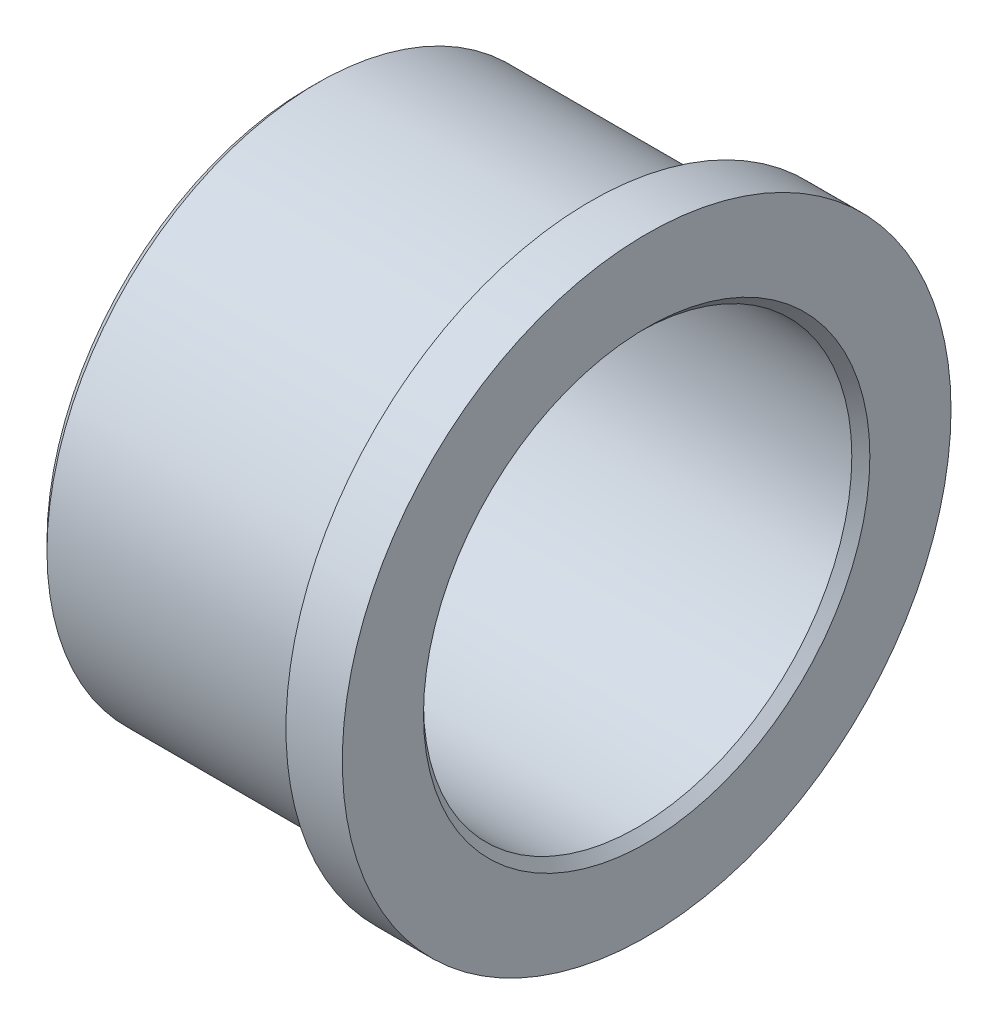
ISO-10303-21;
HEADER;
FILE_DESCRIPTION(('STEP AP214'),'2;1');
FILE_NAME('part.step','',(''),(''),'','','');
FILE_SCHEMA(('AUTOMOTIVE_DESIGN { 1 0 10303 214 1 1 1 1 }'));
ENDSEC;
DATA;
#1=APPLICATION_CONTEXT('core data for automotive mechanical design processes');
#2=APPLICATION_PROTOCOL_DEFINITION('international standard','automotive_design',2000,#1);
#3=PRODUCT_CONTEXT('',#1,'mechanical');
#4=PRODUCT('Part','Part','',(#3));
#5=PRODUCT_RELATED_PRODUCT_CATEGORY('part','',(#4));
#6=PRODUCT_DEFINITION_FORMATION('','',#4);
#7=PRODUCT_DEFINITION_CONTEXT('part definition',#1,'design');
#8=PRODUCT_DEFINITION('design','',#6,#7);
#9=PRODUCT_DEFINITION_SHAPE('','',#8);
#10=(LENGTH_UNIT() NAMED_UNIT(*) SI_UNIT(.MILLI.,.METRE.));
#11=(NAMED_UNIT(*) PLANE_ANGLE_UNIT() SI_UNIT($,.RADIAN.));
#12=(NAMED_UNIT(*) SI_UNIT($,.STERADIAN.) SOLID_ANGLE_UNIT());
#13=UNCERTAINTY_MEASURE_WITH_UNIT(LENGTH_MEASURE(1.E-05),#10,'distance_accuracy_value','');
#14=(GEOMETRIC_REPRESENTATION_CONTEXT(3) GLOBAL_UNCERTAINTY_ASSIGNED_CONTEXT((#13)) GLOBAL_UNIT_ASSIGNED_CONTEXT((#10,
#11,#12)) REPRESENTATION_CONTEXT('',''));
#15=CARTESIAN_POINT('',(0.,0.,0.));
#16=DIRECTION('',(0.,0.,1.));
#17=DIRECTION('',(1.,0.,0.));
#18=AXIS2_PLACEMENT_3D('',#15,#16,#17);
#19=CARTESIAN_POINT('',(0.,25.3690789507421,0.));
#20=DIRECTION('',(-1.,0.,0.));
#21=DIRECTION('',(0.,0.,1.));
#22=AXIS2_PLACEMENT_3D('',#19,#20,#21);
#23=PLANE('',#22);
#24=CARTESIAN_POINT('',(0.,0.,0.));
#25=DIRECTION('',(1.,0.,0.));
#26=DIRECTION('',(0.,0.,-1.));
#27=AXIS2_PLACEMENT_3D('',#24,#25,#26);
#28=CIRCLE('',#27,23.8);
#29=CARTESIAN_POINT('',(0.,0.,-23.8));
#30=VERTEX_POINT('',#29);
#31=EDGE_CURVE('E80',#30,#30,#28,.T.);
#32=ORIENTED_EDGE('',*,*,#31,.T.);
#33=EDGE_LOOP('',(#32));
#34=FACE_BOUND('',#33,.T.);
#35=CARTESIAN_POINT('',(0.,0.,0.));
#36=DIRECTION('',(1.,0.,0.));
#37=DIRECTION('',(0.,0.,-1.));
#38=AXIS2_PLACEMENT_3D('',#35,#36,#37);
#39=CIRCLE('',#38,27.);
#40=CARTESIAN_POINT('',(0.,0.,-27.));
#41=VERTEX_POINT('',#40);
#42=EDGE_CURVE('E68',#41,#41,#39,.T.);
#43=ORIENTED_EDGE('',*,*,#42,.F.);
#44=EDGE_LOOP('',(#43));
#45=FACE_BOUND('',#44,.T.);
#46=ADVANCED_FACE('F41',(#34,#45),#23,.T.);
#47=CARTESIAN_POINT('',(6.5,0.,0.));
#48=DIRECTION('',(1.,0.,0.));
#49=DIRECTION('',(0.,0.,-1.));
#50=AXIS2_PLACEMENT_3D('',#47,#48,#49);
#51=CYLINDRICAL_SURFACE('',#50,27.);
#52=ORIENTED_EDGE('',*,*,#42,.T.);
#53=EDGE_LOOP('',(#52));
#54=FACE_BOUND('',#53,.T.);
#55=CARTESIAN_POINT('',(5.,0.,0.));
#56=DIRECTION('',(1.,0.,0.));
#57=DIRECTION('',(0.,0.,-1.));
#58=AXIS2_PLACEMENT_3D('',#55,#56,#57);
#59=CIRCLE('',#58,27.);
#60=CARTESIAN_POINT('',(5.,0.,-27.));
#61=VERTEX_POINT('',#60);
#62=EDGE_CURVE('E71',#61,#61,#59,.T.);
#63=ORIENTED_EDGE('',*,*,#62,.F.);
#64=EDGE_LOOP('',(#63));
#65=FACE_BOUND('',#64,.T.);
#66=ADVANCED_FACE('F104',(#54,#65),#51,.T.);
#67=CARTESIAN_POINT('',(5.,27.,0.));
#68=DIRECTION('',(1.,0.,0.));
#69=DIRECTION('',(0.,0.,-1.));
#70=AXIS2_PLACEMENT_3D('',#67,#68,#69);
#71=PLANE('',#70);
#72=CARTESIAN_POINT('',(5.,0.,0.));
#73=DIRECTION('',(1.,0.,0.));
#74=DIRECTION('',(0.,0.,-1.));
#75=AXIS2_PLACEMENT_3D('',#72,#73,#74);
#76=CIRCLE('',#75,19.8);
#77=CARTESIAN_POINT('',(5.,0.,-19.8));
#78=VERTEX_POINT('',#77);
#79=EDGE_CURVE('E57',#78,#78,#76,.F.);
#80=ORIENTED_EDGE('',*,*,#79,.T.);
#81=EDGE_LOOP('',(#80));
#82=FACE_BOUND('',#81,.T.);
#83=ORIENTED_EDGE('',*,*,#62,.T.);
#84=EDGE_LOOP('',(#83));
#85=FACE_BOUND('',#84,.T.);
#86=ADVANCED_FACE('F109',(#82,#85),#71,.T.);
#87=CARTESIAN_POINT('',(6.5,0.,0.));
#88=DIRECTION('',(1.,0.,0.));
#89=DIRECTION('',(0.,0.,-1.));
#90=AXIS2_PLACEMENT_3D('',#87,#88,#89);
#91=CYLINDRICAL_SURFACE('',#90,19.);
#92=CARTESIAN_POINT('',(4.20000000000002,0.,0.));
#93=DIRECTION('',(1.,0.,0.));
#94=DIRECTION('',(0.,0.,-1.));
#95=AXIS2_PLACEMENT_3D('',#92,#93,#94);
#96=CIRCLE('',#95,19.);
#97=CARTESIAN_POINT('',(4.20000000000002,0.,-19.));
#98=VERTEX_POINT('',#97);
#99=EDGE_CURVE('E62',#98,#98,#96,.T.);
#100=ORIENTED_EDGE('',*,*,#99,.T.);
#101=EDGE_LOOP('',(#100));
#102=FACE_BOUND('',#101,.T.);
#103=CARTESIAN_POINT('',(-24.2,0.,0.));
#104=DIRECTION('',(-1.,0.,0.));
#105=DIRECTION('',(0.,0.,1.));
#106=AXIS2_PLACEMENT_3D('',#103,#104,#105);
#107=CIRCLE('',#106,19.);
#108=CARTESIAN_POINT('',(-24.2,0.,19.));
#109=VERTEX_POINT('',#108);
#110=EDGE_CURVE('E65',#109,#109,#107,.T.);
#111=ORIENTED_EDGE('',*,*,#110,.T.);
#112=EDGE_LOOP('',(#111));
#113=FACE_BOUND('',#112,.T.);
#114=ADVANCED_FACE('F138',(#102,#113),#91,.F.);
#115=CARTESIAN_POINT('',(-25.,19.,0.));
#116=DIRECTION('',(-1.,0.,0.));
#117=DIRECTION('',(0.,0.,1.));
#118=AXIS2_PLACEMENT_3D('',#115,#116,#117);
#119=PLANE('',#118);
#120=CARTESIAN_POINT('',(-25.,0.,0.));
#121=DIRECTION('',(-1.,0.,0.));
#122=DIRECTION('',(0.,0.,1.));
#123=AXIS2_PLACEMENT_3D('',#120,#121,#122);
#124=CIRCLE('',#123,23.2);
#125=CARTESIAN_POINT('',(-25.,0.,23.2));
#126=VERTEX_POINT('',#125);
#127=EDGE_CURVE('E10',#126,#126,#124,.T.);
#128=ORIENTED_EDGE('',*,*,#127,.T.);
#129=EDGE_LOOP('',(#128));
#130=FACE_BOUND('',#129,.T.);
#131=CARTESIAN_POINT('',(-25.,0.,0.));
#132=DIRECTION('',(-1.,0.,0.));
#133=DIRECTION('',(0.,0.,1.));
#134=AXIS2_PLACEMENT_3D('',#131,#132,#133);
#135=CIRCLE('',#134,19.8);
#136=CARTESIAN_POINT('',(-25.,0.,19.8));
#137=VERTEX_POINT('',#136);
#138=EDGE_CURVE('E49',#137,#137,#135,.F.);
#139=ORIENTED_EDGE('',*,*,#138,.T.);
#140=EDGE_LOOP('',(#139));
#141=FACE_BOUND('',#140,.T.);
#142=ADVANCED_FACE('F130',(#130,#141),#119,.T.);
#143=CARTESIAN_POINT('',(6.5,0.,0.));
#144=DIRECTION('',(1.,0.,0.));
#145=DIRECTION('',(0.,0.,-1.));
#146=AXIS2_PLACEMENT_3D('',#143,#144,#145);
#147=CYLINDRICAL_SURFACE('',#146,24.);
#148=CARTESIAN_POINT('',(-24.2,0.,0.));
#149=DIRECTION('',(-1.,0.,0.));
#150=DIRECTION('',(0.,0.,1.));
#151=AXIS2_PLACEMENT_3D('',#148,#149,#150);
#152=CIRCLE('',#151,24.);
#153=CARTESIAN_POINT('',(-24.2,0.,24.));
#154=VERTEX_POINT('',#153);
#155=EDGE_CURVE('E53',#154,#154,#152,.F.);
#156=ORIENTED_EDGE('',*,*,#155,.T.);
#157=EDGE_LOOP('',(#156));
#158=FACE_BOUND('',#157,.T.);
#159=CARTESIAN_POINT('',(-2.,0.,0.));
#160=DIRECTION('',(1.,0.,0.));
#161=DIRECTION('',(0.,0.,-1.));
#162=AXIS2_PLACEMENT_3D('',#159,#160,#161);
#163=CIRCLE('',#162,24.);
#164=CARTESIAN_POINT('',(-2.,0.,-24.));
#165=VERTEX_POINT('',#164);
#166=EDGE_CURVE('E74',#165,#165,#163,.T.);
#167=ORIENTED_EDGE('',*,*,#166,.F.);
#168=EDGE_LOOP('',(#167));
#169=FACE_BOUND('',#168,.T.);
#170=ADVANCED_FACE('F100',(#158,#169),#147,.T.);
#171=CARTESIAN_POINT('',(-2.,23.8,0.));
#172=DIRECTION('',(1.,0.,0.));
#173=DIRECTION('',(0.,0.,-1.));
#174=AXIS2_PLACEMENT_3D('',#171,#172,#173);
#175=PLANE('',#174);
#176=ORIENTED_EDGE('',*,*,#166,.T.);
#177=EDGE_LOOP('',(#176));
#178=FACE_BOUND('',#177,.T.);
#179=CARTESIAN_POINT('',(-2.,0.,0.));
#180=DIRECTION('',(1.,0.,0.));
#181=DIRECTION('',(0.,0.,-1.));
#182=AXIS2_PLACEMENT_3D('',#179,#180,#181);
#183=CIRCLE('',#182,23.8);
#184=CARTESIAN_POINT('',(-2.,0.,-23.8));
#185=VERTEX_POINT('',#184);
#186=EDGE_CURVE('E77',#185,#185,#183,.T.);
#187=ORIENTED_EDGE('',*,*,#186,.F.);
#188=EDGE_LOOP('',(#187));
#189=FACE_BOUND('',#188,.T.);
#190=ADVANCED_FACE('F89',(#178,#189),#175,.T.);
#191=CARTESIAN_POINT('',(6.5,0.,0.));
#192=DIRECTION('',(1.,0.,0.));
#193=DIRECTION('',(0.,0.,-1.));
#194=AXIS2_PLACEMENT_3D('',#191,#192,#193);
#195=CYLINDRICAL_SURFACE('',#194,23.8);
#196=ORIENTED_EDGE('',*,*,#186,.T.);
#197=EDGE_LOOP('',(#196));
#198=FACE_BOUND('',#197,.T.);
#199=ORIENTED_EDGE('',*,*,#31,.F.);
#200=EDGE_LOOP('',(#199));
#201=FACE_BOUND('',#200,.T.);
#202=ADVANCED_FACE('F86',(#198,#201),#195,.T.);
#203=CARTESIAN_POINT('',(4.20000000000002,0.,0.));
#204=DIRECTION('',(1.,0.,0.));
#205=DIRECTION('',(0.,0.,-1.));
#206=AXIS2_PLACEMENT_3D('',#203,#204,#205);
#207=CONICAL_SURFACE('',#206,19.,0.785398163397455);
#208=CARTESIAN_POINT('',(5.,0.,-19.8));
#209=CARTESIAN_POINT('',(4.99166666666667,0.,-19.7916666666667));
#210=CARTESIAN_POINT('',(4.98333333333333,0.,-19.7833333333333));
#211=CARTESIAN_POINT('',(4.96666666666667,0.,-19.7666666666667));
#212=CARTESIAN_POINT('',(4.95833333333333,0.,-19.7583333333333));
#213=CARTESIAN_POINT('',(4.94166666666667,0.,-19.7416666666667));
#214=CARTESIAN_POINT('',(4.93333333333334,0.,-19.7333333333333));
#215=CARTESIAN_POINT('',(4.91666666666667,0.,-19.7166666666667));
#216=CARTESIAN_POINT('',(4.90833333333334,0.,-19.7083333333333));
#217=CARTESIAN_POINT('',(4.89166666666667,0.,-19.6916666666667));
#218=CARTESIAN_POINT('',(4.88333333333334,0.,-19.6833333333333));
#219=CARTESIAN_POINT('',(4.86666666666667,0.,-19.6666666666667));
#220=CARTESIAN_POINT('',(4.85833333333334,0.,-19.6583333333333));
#221=CARTESIAN_POINT('',(4.84166666666667,0.,-19.6416666666667));
#222=CARTESIAN_POINT('',(4.83333333333334,0.,-19.6333333333333));
#223=CARTESIAN_POINT('',(4.81666666666667,0.,-19.6166666666667));
#224=CARTESIAN_POINT('',(4.80833333333334,0.,-19.6083333333333));
#225=CARTESIAN_POINT('',(4.79166666666667,0.,-19.5916666666667));
#226=CARTESIAN_POINT('',(4.78333333333334,0.,-19.5833333333333));
#227=CARTESIAN_POINT('',(4.76666666666667,0.,-19.5666666666667));
#228=CARTESIAN_POINT('',(4.75833333333334,0.,-19.5583333333333));
#229=CARTESIAN_POINT('',(4.74166666666667,0.,-19.5416666666667));
#230=CARTESIAN_POINT('',(4.73333333333334,0.,-19.5333333333333));
#231=CARTESIAN_POINT('',(4.71666666666667,0.,-19.5166666666667));
#232=CARTESIAN_POINT('',(4.70833333333334,0.,-19.5083333333333));
#233=CARTESIAN_POINT('',(4.69166666666668,0.,-19.4916666666667));
#234=CARTESIAN_POINT('',(4.68333333333334,0.,-19.4833333333333));
#235=CARTESIAN_POINT('',(4.66666666666668,0.,-19.4666666666667));
#236=CARTESIAN_POINT('',(4.65833333333334,0.,-19.4583333333333));
#237=CARTESIAN_POINT('',(4.64166666666668,0.,-19.4416666666667));
#238=CARTESIAN_POINT('',(4.63333333333334,0.,-19.4333333333333));
#239=CARTESIAN_POINT('',(4.61666666666668,0.,-19.4166666666667));
#240=CARTESIAN_POINT('',(4.60833333333334,0.,-19.4083333333333));
#241=CARTESIAN_POINT('',(4.59166666666668,0.,-19.3916666666667));
#242=CARTESIAN_POINT('',(4.58333333333335,0.,-19.3833333333333));
#243=CARTESIAN_POINT('',(4.56666666666668,0.,-19.3666666666667));
#244=CARTESIAN_POINT('',(4.55833333333335,0.,-19.3583333333333));
#245=CARTESIAN_POINT('',(4.54166666666668,0.,-19.3416666666667));
#246=CARTESIAN_POINT('',(4.53333333333335,0.,-19.3333333333333));
#247=CARTESIAN_POINT('',(4.51666666666668,0.,-19.3166666666667));
#248=CARTESIAN_POINT('',(4.50833333333335,0.,-19.3083333333333));
#249=CARTESIAN_POINT('',(4.49166666666668,0.,-19.2916666666667));
#250=CARTESIAN_POINT('',(4.48333333333335,0.,-19.2833333333333));
#251=CARTESIAN_POINT('',(4.46666666666668,0.,-19.2666666666667));
#252=CARTESIAN_POINT('',(4.45833333333335,0.,-19.2583333333333));
#253=CARTESIAN_POINT('',(4.44166666666668,0.,-19.2416666666667));
#254=CARTESIAN_POINT('',(4.43333333333335,0.,-19.2333333333333));
#255=CARTESIAN_POINT('',(4.41666666666668,0.,-19.2166666666667));
#256=CARTESIAN_POINT('',(4.40833333333335,0.,-19.2083333333333));
#257=CARTESIAN_POINT('',(4.39166666666668,0.,-19.1916666666667));
#258=CARTESIAN_POINT('',(4.38333333333335,0.,-19.1833333333333));
#259=CARTESIAN_POINT('',(4.36666666666668,0.,-19.1666666666667));
#260=CARTESIAN_POINT('',(4.35833333333335,0.,-19.1583333333333));
#261=CARTESIAN_POINT('',(4.34166666666669,0.,-19.1416666666667));
#262=CARTESIAN_POINT('',(4.33333333333335,0.,-19.1333333333333));
#263=CARTESIAN_POINT('',(4.31666666666669,0.,-19.1166666666667));
#264=CARTESIAN_POINT('',(4.30833333333335,0.,-19.1083333333333));
#265=CARTESIAN_POINT('',(4.29166666666669,0.,-19.0916666666667));
#266=CARTESIAN_POINT('',(4.28333333333335,0.,-19.0833333333333));
#267=CARTESIAN_POINT('',(4.26666666666669,0.,-19.0666666666667));
#268=CARTESIAN_POINT('',(4.25833333333335,0.,-19.0583333333333));
#269=CARTESIAN_POINT('',(4.24166666666669,0.,-19.0416666666667));
#270=CARTESIAN_POINT('',(4.23333333333336,0.,-19.0333333333333));
#271=CARTESIAN_POINT('',(4.21666666666669,0.,-19.0166666666667));
#272=CARTESIAN_POINT('',(4.20833333333336,0.,-19.0083333333333));
#273=CARTESIAN_POINT('',(4.20000000000002,0.,-19.));
#274=B_SPLINE_CURVE_WITH_KNOTS('',3,(#208,#209,#210,#211,#212,#213,#214,#215,#216,#217,#218,
#219,#220,#221,#222,#223,#224,#225,#226,#227,#228,#229,#230,#231,#232,#233,#234,#235,#236,#237,
#238,#239,#240,#241,#242,#243,#244,#245,#246,#247,#248,#249,#250,#251,#252,#253,#254,#255,#256,
#257,#258,#259,#260,#261,#262,#263,#264,#265,#266,#267,#268,#269,#270,#271,#272,#273),
.UNSPECIFIED.,.F.,.F.,(4,2,2,2,2,2,2,2,2,2,2,2,2,2,2,2,2,2,2,2,2,2,2,2,2,2,2,2,2,2,2,2,4),(0.,
0.0353553390593272,0.0707106781186519,0.10606601717798,0.141421356237307,0.176776695296634,
0.212132034355959,0.247487373415286,0.282842712474614,0.318198051533939,0.353553390593266,
0.388908729652594,0.424264068711919,0.459619407771246,0.494974746830574,0.530330085889898,
0.565685424949226,0.601040764008553,0.636396103067878,0.671751442127206,0.707106781186533,
0.74246212024586,0.777817459305185,0.813172798364513,0.84852813742384,0.883883476483165,
0.919238815542492,0.95459415460182,0.989949493661145,1.02530483272047,1.0606601717798,
1.09601551083912,1.13137084989845),.UNSPECIFIED.);
#275=EDGE_CURVE('BSEAM88',#78,#98,#274,.T.);
#276=ORIENTED_EDGE('',*,*,#79,.F.);
#277=ORIENTED_EDGE('',*,*,#99,.F.);
#278=ORIENTED_EDGE('',*,*,#275,.T.);
#279=ORIENTED_EDGE('',*,*,#275,.F.);
#280=EDGE_LOOP('',(#276,#278,#277,#279));
#281=FACE_BOUND('',#280,.T.);
#282=ADVANCED_FACE('F88',(#281),#207,.F.);
#283=CARTESIAN_POINT('',(-24.2,0.,0.));
#284=DIRECTION('',(1.,0.,0.));
#285=DIRECTION('',(0.,0.,-1.));
#286=AXIS2_PLACEMENT_3D('',#283,#284,#285);
#287=CONICAL_SURFACE('',#286,24.,0.785398163397444);
#288=ORIENTED_EDGE('',*,*,#127,.F.);
#289=EDGE_LOOP('',(#288));
#290=FACE_BOUND('',#289,.T.);
#291=ORIENTED_EDGE('',*,*,#155,.F.);
#292=EDGE_LOOP('',(#291));
#293=FACE_BOUND('',#292,.T.);
#294=ADVANCED_FACE('F97',(#290,#293),#287,.T.);
#295=CARTESIAN_POINT('',(-25.,0.,0.));
#296=DIRECTION('',(-1.,0.,0.));
#297=DIRECTION('',(0.,0.,1.));
#298=AXIS2_PLACEMENT_3D('',#295,#296,#297);
#299=CONICAL_SURFACE('',#298,19.8,0.785398163397444);
#300=ORIENTED_EDGE('',*,*,#110,.F.);
#301=EDGE_LOOP('',(#300));
#302=FACE_BOUND('',#301,.T.);
#303=ORIENTED_EDGE('',*,*,#138,.F.);
#304=EDGE_LOOP('',(#303));
#305=FACE_BOUND('',#304,.T.);
#306=ADVANCED_FACE('F44',(#302,#305),#299,.F.);
#307=CLOSED_SHELL('',(#46,#66,#86,#114,#142,#170,#190,#202,#282,#294,#306));
#308=MANIFOLD_SOLID_BREP('B2',#307);
#309=ADVANCED_BREP_SHAPE_REPRESENTATION('',(#18,#308),#14);
#310=SHAPE_DEFINITION_REPRESENTATION(#9,#309);
ENDSEC;
END-ISO-10303-21;
